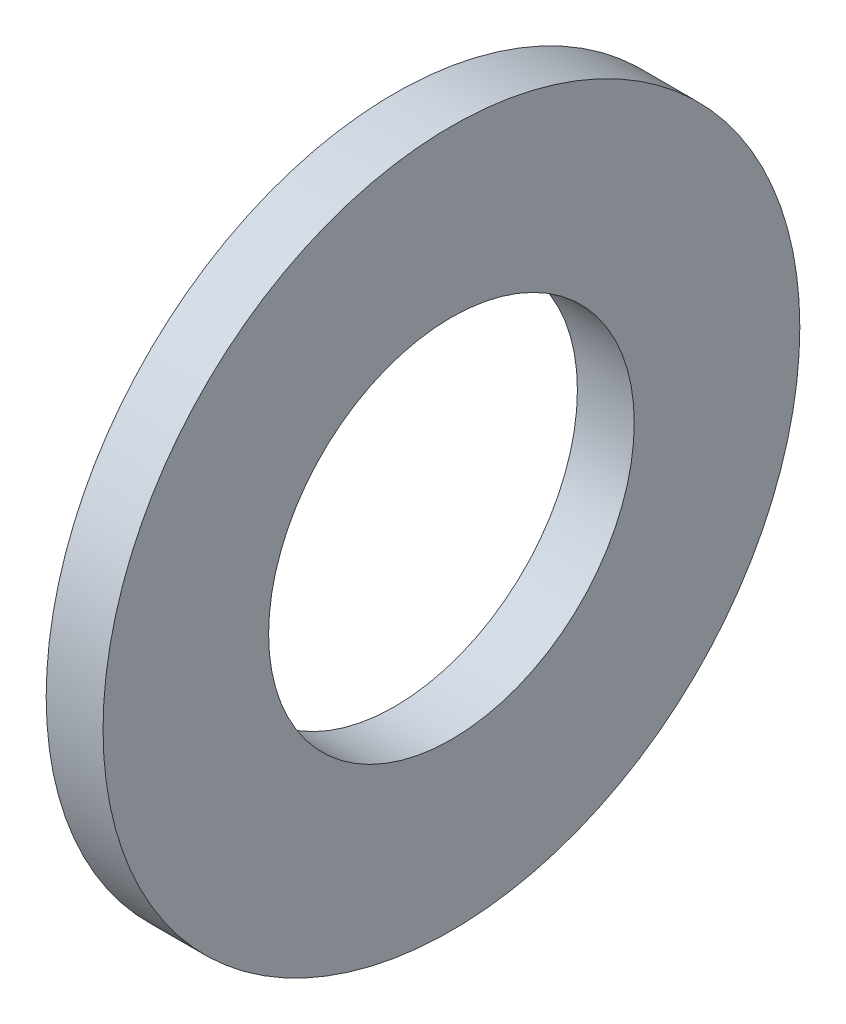
ISO-10303-21;
HEADER;
FILE_DESCRIPTION(('STEP AP214'),'2;1');
FILE_NAME('part.step','',(''),(''),'','','');
FILE_SCHEMA(('AUTOMOTIVE_DESIGN { 1 0 10303 214 1 1 1 1 }'));
ENDSEC;
DATA;
#1=APPLICATION_CONTEXT('core data for automotive mechanical design processes');
#2=APPLICATION_PROTOCOL_DEFINITION('international standard','automotive_design',2000,#1);
#3=PRODUCT_CONTEXT('',#1,'mechanical');
#4=PRODUCT('Part','Part','',(#3));
#5=PRODUCT_RELATED_PRODUCT_CATEGORY('part','',(#4));
#6=PRODUCT_DEFINITION_FORMATION('','',#4);
#7=PRODUCT_DEFINITION_CONTEXT('part definition',#1,'design');
#8=PRODUCT_DEFINITION('design','',#6,#7);
#9=PRODUCT_DEFINITION_SHAPE('','',#8);
#10=(LENGTH_UNIT() NAMED_UNIT(*) SI_UNIT(.MILLI.,.METRE.));
#11=(NAMED_UNIT(*) PLANE_ANGLE_UNIT() SI_UNIT($,.RADIAN.));
#12=(NAMED_UNIT(*) SI_UNIT($,.STERADIAN.) SOLID_ANGLE_UNIT());
#13=UNCERTAINTY_MEASURE_WITH_UNIT(LENGTH_MEASURE(1.E-05),#10,'distance_accuracy_value','');
#14=(GEOMETRIC_REPRESENTATION_CONTEXT(3) GLOBAL_UNCERTAINTY_ASSIGNED_CONTEXT((#13)) GLOBAL_UNIT_ASSIGNED_CONTEXT((#10,
#11,#12)) REPRESENTATION_CONTEXT('',''));
#15=CARTESIAN_POINT('',(0.,0.,0.));
#16=DIRECTION('',(0.,0.,1.));
#17=DIRECTION('',(1.,0.,0.));
#18=AXIS2_PLACEMENT_3D('',#15,#16,#17);
#19=CARTESIAN_POINT('',(1.2954,0.,0.));
#20=DIRECTION('',(1.,0.,0.));
#21=DIRECTION('',(0.,0.,-1.));
#22=AXIS2_PLACEMENT_3D('',#19,#20,#21);
#23=PLANE('',#22);
#24=CARTESIAN_POINT('',(1.2954,0.,0.));
#25=DIRECTION('',(1.,0.,0.));
#26=DIRECTION('',(0.,0.,-1.));
#27=AXIS2_PLACEMENT_3D('',#24,#25,#26);
#28=CIRCLE('',#27,7.9375);
#29=CARTESIAN_POINT('',(1.2954,0.,-7.9375));
#30=VERTEX_POINT('',#29);
#31=EDGE_CURVE('E10',#30,#30,#28,.T.);
#32=ORIENTED_EDGE('',*,*,#31,.T.);
#33=EDGE_LOOP('',(#32));
#34=FACE_BOUND('',#33,.T.);
#35=CARTESIAN_POINT('',(1.2954,0.,0.));
#36=DIRECTION('',(1.,0.,0.));
#37=DIRECTION('',(0.,0.,-1.));
#38=AXIS2_PLACEMENT_3D('',#35,#36,#37);
#39=CIRCLE('',#38,4.1656);
#40=CARTESIAN_POINT('',(1.2954,0.,-4.1656));
#41=VERTEX_POINT('',#40);
#42=EDGE_CURVE('E44',#41,#41,#39,.T.);
#43=ORIENTED_EDGE('',*,*,#42,.F.);
#44=EDGE_LOOP('',(#43));
#45=FACE_BOUND('',#44,.T.);
#46=ADVANCED_FACE('F33',(#34,#45),#23,.T.);
#47=CARTESIAN_POINT('',(0.,0.,0.));
#48=DIRECTION('',(1.,0.,0.));
#49=DIRECTION('',(0.,0.,-1.));
#50=AXIS2_PLACEMENT_3D('',#47,#48,#49);
#51=PLANE('',#50);
#52=CARTESIAN_POINT('',(0.,0.,0.));
#53=DIRECTION('',(1.,0.,0.));
#54=DIRECTION('',(0.,0.,-1.));
#55=AXIS2_PLACEMENT_3D('',#52,#53,#54);
#56=CIRCLE('',#55,7.9375);
#57=CARTESIAN_POINT('',(0.,0.,-7.9375));
#58=VERTEX_POINT('',#57);
#59=EDGE_CURVE('E37',#58,#58,#56,.T.);
#60=ORIENTED_EDGE('',*,*,#59,.F.);
#61=EDGE_LOOP('',(#60));
#62=FACE_BOUND('',#61,.T.);
#63=CARTESIAN_POINT('',(0.,0.,0.));
#64=DIRECTION('',(1.,0.,0.));
#65=DIRECTION('',(0.,0.,-1.));
#66=AXIS2_PLACEMENT_3D('',#63,#64,#65);
#67=CIRCLE('',#66,4.1656);
#68=CARTESIAN_POINT('',(0.,0.,-4.1656));
#69=VERTEX_POINT('',#68);
#70=EDGE_CURVE('E46',#69,#69,#67,.T.);
#71=ORIENTED_EDGE('',*,*,#70,.T.);
#72=EDGE_LOOP('',(#71));
#73=FACE_BOUND('',#72,.T.);
#74=ADVANCED_FACE('F56',(#62,#73),#51,.F.);
#75=CARTESIAN_POINT('',(1.2954,0.,0.));
#76=DIRECTION('',(-1.,0.,0.));
#77=DIRECTION('',(0.,0.,1.));
#78=AXIS2_PLACEMENT_3D('',#75,#76,#77);
#79=CYLINDRICAL_SURFACE('',#78,7.9375);
#80=ORIENTED_EDGE('',*,*,#31,.F.);
#81=EDGE_LOOP('',(#80));
#82=FACE_BOUND('',#81,.T.);
#83=ORIENTED_EDGE('',*,*,#59,.T.);
#84=EDGE_LOOP('',(#83));
#85=FACE_BOUND('',#84,.T.);
#86=ADVANCED_FACE('F35',(#82,#85),#79,.T.);
#87=CARTESIAN_POINT('',(1.2954,0.,0.));
#88=DIRECTION('',(-1.,0.,0.));
#89=DIRECTION('',(0.,0.,1.));
#90=AXIS2_PLACEMENT_3D('',#87,#88,#89);
#91=CYLINDRICAL_SURFACE('',#90,4.1656);
#92=ORIENTED_EDGE('',*,*,#42,.T.);
#93=EDGE_LOOP('',(#92));
#94=FACE_BOUND('',#93,.T.);
#95=ORIENTED_EDGE('',*,*,#70,.F.);
#96=EDGE_LOOP('',(#95));
#97=FACE_BOUND('',#96,.T.);
#98=ADVANCED_FACE('F52',(#94,#97),#91,.F.);
#99=CLOSED_SHELL('',(#46,#74,#86,#98));
#100=MANIFOLD_SOLID_BREP('B2',#99);
#101=ADVANCED_BREP_SHAPE_REPRESENTATION('',(#18,#100),#14);
#102=SHAPE_DEFINITION_REPRESENTATION(#9,#101);
ENDSEC;
END-ISO-10303-21;
